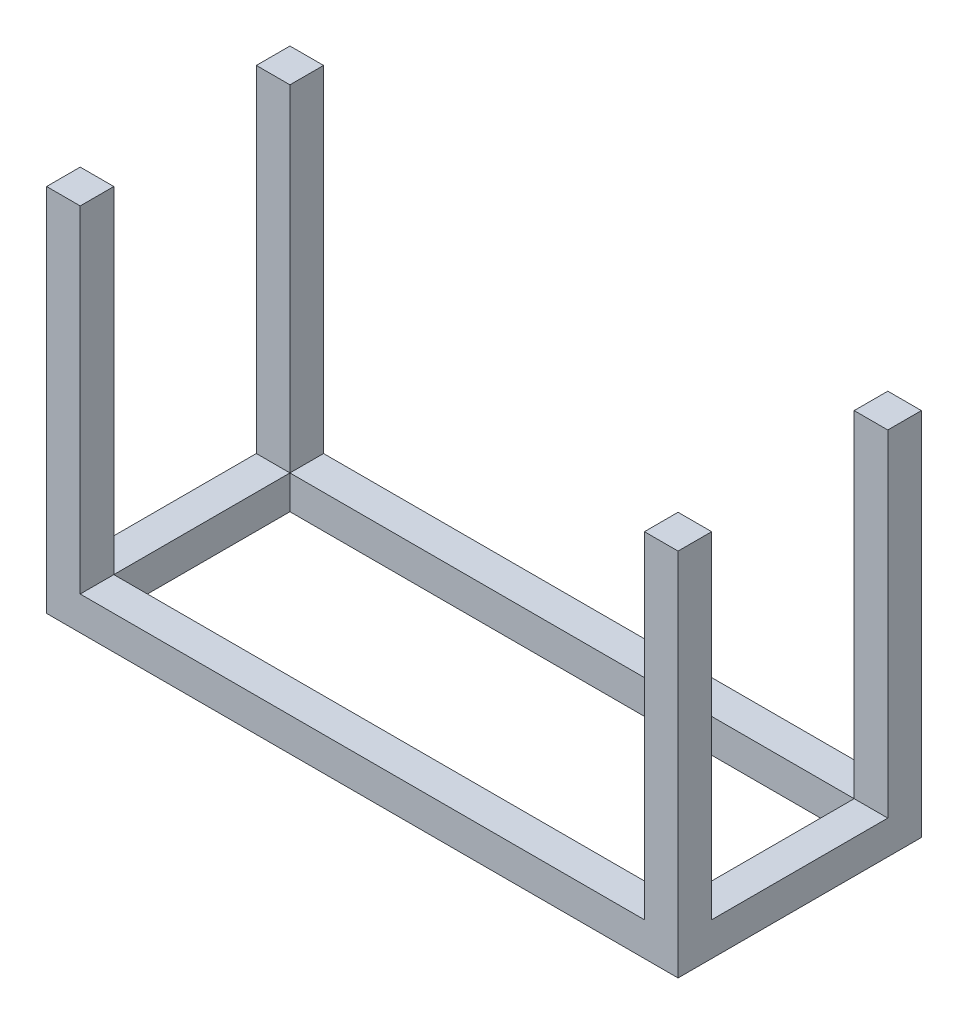
ISO-10303-21;
HEADER;
FILE_DESCRIPTION(('STEP AP214'),'2;1');
FILE_NAME('part.step','',(''),(''),'','','');
FILE_SCHEMA(('AUTOMOTIVE_DESIGN { 1 0 10303 214 1 1 1 1 }'));
ENDSEC;
DATA;
#1=APPLICATION_CONTEXT('core data for automotive mechanical design processes');
#2=APPLICATION_PROTOCOL_DEFINITION('international standard','automotive_design',2000,#1);
#3=PRODUCT_CONTEXT('',#1,'mechanical');
#4=PRODUCT('Part','Part','',(#3));
#5=PRODUCT_RELATED_PRODUCT_CATEGORY('part','',(#4));
#6=PRODUCT_DEFINITION_FORMATION('','',#4);
#7=PRODUCT_DEFINITION_CONTEXT('part definition',#1,'design');
#8=PRODUCT_DEFINITION('design','',#6,#7);
#9=PRODUCT_DEFINITION_SHAPE('','',#8);
#10=(LENGTH_UNIT() NAMED_UNIT(*) SI_UNIT(.MILLI.,.METRE.));
#11=(NAMED_UNIT(*) PLANE_ANGLE_UNIT() SI_UNIT($,.RADIAN.));
#12=(NAMED_UNIT(*) SI_UNIT($,.STERADIAN.) SOLID_ANGLE_UNIT());
#13=UNCERTAINTY_MEASURE_WITH_UNIT(LENGTH_MEASURE(1.E-05),#10,'distance_accuracy_value','');
#14=(GEOMETRIC_REPRESENTATION_CONTEXT(3) GLOBAL_UNCERTAINTY_ASSIGNED_CONTEXT((#13)) GLOBAL_UNIT_ASSIGNED_CONTEXT((#10,
#11,#12)) REPRESENTATION_CONTEXT('',''));
#15=CARTESIAN_POINT('',(0.,0.,0.));
#16=DIRECTION('',(0.,0.,1.));
#17=DIRECTION('',(1.,0.,0.));
#18=AXIS2_PLACEMENT_3D('',#15,#16,#17);
#19=CARTESIAN_POINT('',(0.,7.5,0.));
#20=DIRECTION('',(0.,-1.,0.));
#21=DIRECTION('',(0.,0.,-1.));
#22=AXIS2_PLACEMENT_3D('',#19,#20,#21);
#23=PLANE('',#22);
#24=DIRECTION('',(0.,0.,-1.));
#25=VECTOR('',#24,1.);
#26=CARTESIAN_POINT('',(-62.95,7.5,19.65));
#27=LINE('',#26,#25);
#28=CARTESIAN_POINT('',(-62.95,7.5,27.15));
#29=VERTEX_POINT('',#28);
#30=CARTESIAN_POINT('',(-62.95,7.5,19.65));
#31=VERTEX_POINT('',#30);
#32=EDGE_CURVE('E177',#29,#31,#27,.T.);
#33=ORIENTED_EDGE('',*,*,#32,.F.);
#34=DIRECTION('',(1.,0.,0.));
#35=VECTOR('',#34,1.);
#36=CARTESIAN_POINT('',(-70.45,7.5,27.15));
#37=LINE('',#36,#35);
#38=CARTESIAN_POINT('',(62.95,7.5,27.15));
#39=VERTEX_POINT('',#38);
#40=EDGE_CURVE('E162',#29,#39,#37,.T.);
#41=ORIENTED_EDGE('',*,*,#40,.T.);
#42=DIRECTION('',(0.,0.,1.));
#43=VECTOR('',#42,1.);
#44=CARTESIAN_POINT('',(62.95,7.5,19.65));
#45=LINE('',#44,#43);
#46=CARTESIAN_POINT('',(62.95,7.5,19.65));
#47=VERTEX_POINT('',#46);
#48=EDGE_CURVE('E213',#47,#39,#45,.T.);
#49=ORIENTED_EDGE('',*,*,#48,.F.);
#50=DIRECTION('',(1.,0.,0.));
#51=VECTOR('',#50,1.);
#52=CARTESIAN_POINT('',(-62.95,7.5,19.65));
#53=LINE('',#52,#51);
#54=EDGE_CURVE('E179',#31,#47,#53,.T.);
#55=ORIENTED_EDGE('',*,*,#54,.F.);
#56=EDGE_LOOP('',(#33,#41,#49,#55));
#57=FACE_BOUND('',#56,.T.);
#58=ADVANCED_FACE('F36',(#57),#23,.F.);
#59=DIRECTION('',(-1.,0.,0.));
#60=VECTOR('',#59,1.);
#61=CARTESIAN_POINT('',(-62.95,7.5,19.65));
#62=LINE('',#61,#60);
#63=CARTESIAN_POINT('',(-70.45,7.5,19.65));
#64=VERTEX_POINT('',#63);
#65=EDGE_CURVE('E183',#31,#64,#62,.T.);
#66=ORIENTED_EDGE('',*,*,#65,.F.);
#67=DIRECTION('',(0.,0.,1.));
#68=VECTOR('',#67,1.);
#69=CARTESIAN_POINT('',(-62.95,7.5,19.65));
#70=LINE('',#69,#68);
#71=CARTESIAN_POINT('',(-62.95,7.5,-19.65));
#72=VERTEX_POINT('',#71);
#73=EDGE_CURVE('E282',#72,#31,#70,.T.);
#74=ORIENTED_EDGE('',*,*,#73,.F.);
#75=DIRECTION('',(1.,0.,0.));
#76=VECTOR('',#75,1.);
#77=CARTESIAN_POINT('',(-70.45,7.5,-19.65));
#78=LINE('',#77,#76);
#79=CARTESIAN_POINT('',(-70.45,7.5,-19.65));
#80=VERTEX_POINT('',#79);
#81=EDGE_CURVE('E241',#80,#72,#78,.T.);
#82=ORIENTED_EDGE('',*,*,#81,.F.);
#83=DIRECTION('',(0.,0.,1.));
#84=VECTOR('',#83,1.);
#85=CARTESIAN_POINT('',(-70.45,7.5,27.15));
#86=LINE('',#85,#84);
#87=EDGE_CURVE('E51',#80,#64,#86,.T.);
#88=ORIENTED_EDGE('',*,*,#87,.T.);
#89=EDGE_LOOP('',(#66,#74,#82,#88));
#90=FACE_BOUND('',#89,.T.);
#91=ADVANCED_FACE('F368',(#90),#23,.F.);
#92=DIRECTION('',(-1.,0.,0.));
#93=VECTOR('',#92,1.);
#94=CARTESIAN_POINT('',(62.95,7.5,19.65));
#95=LINE('',#94,#93);
#96=CARTESIAN_POINT('',(70.45,7.5,19.65));
#97=VERTEX_POINT('',#96);
#98=EDGE_CURVE('E59',#97,#47,#95,.T.);
#99=ORIENTED_EDGE('',*,*,#98,.F.);
#100=DIRECTION('',(0.,0.,-1.));
#101=VECTOR('',#100,1.);
#102=CARTESIAN_POINT('',(70.45,7.5,27.15));
#103=LINE('',#102,#101);
#104=CARTESIAN_POINT('',(70.45,7.5,-19.65));
#105=VERTEX_POINT('',#104);
#106=EDGE_CURVE('E307',#97,#105,#103,.T.);
#107=ORIENTED_EDGE('',*,*,#106,.T.);
#108=DIRECTION('',(1.,0.,0.));
#109=VECTOR('',#108,1.);
#110=CARTESIAN_POINT('',(62.95,7.5,-19.65));
#111=LINE('',#110,#109);
#112=CARTESIAN_POINT('',(62.95,7.5,-19.65));
#113=VERTEX_POINT('',#112);
#114=EDGE_CURVE('E234',#113,#105,#111,.T.);
#115=ORIENTED_EDGE('',*,*,#114,.F.);
#116=DIRECTION('',(0.,0.,-1.));
#117=VECTOR('',#116,1.);
#118=CARTESIAN_POINT('',(62.95,7.5,19.65));
#119=LINE('',#118,#117);
#120=EDGE_CURVE('E275',#47,#113,#119,.T.);
#121=ORIENTED_EDGE('',*,*,#120,.F.);
#122=EDGE_LOOP('',(#99,#107,#115,#121));
#123=FACE_BOUND('',#122,.T.);
#124=ADVANCED_FACE('F355',(#123),#23,.F.);
#125=DIRECTION('',(0.,0.,1.));
#126=VECTOR('',#125,1.);
#127=CARTESIAN_POINT('',(62.95,7.5,-19.65));
#128=LINE('',#127,#126);
#129=CARTESIAN_POINT('',(62.95,7.5,-27.15));
#130=VERTEX_POINT('',#129);
#131=EDGE_CURVE('E237',#130,#113,#128,.T.);
#132=ORIENTED_EDGE('',*,*,#131,.F.);
#133=DIRECTION('',(-1.,0.,0.));
#134=VECTOR('',#133,1.);
#135=CARTESIAN_POINT('',(-70.45,7.5,-27.15));
#136=LINE('',#135,#134);
#137=CARTESIAN_POINT('',(-62.95,7.5,-27.15));
#138=VERTEX_POINT('',#137);
#139=EDGE_CURVE('E309',#130,#138,#136,.T.);
#140=ORIENTED_EDGE('',*,*,#139,.T.);
#141=DIRECTION('',(0.,0.,-1.));
#142=VECTOR('',#141,1.);
#143=CARTESIAN_POINT('',(-62.95,7.5,-27.15));
#144=LINE('',#143,#142);
#145=EDGE_CURVE('E254',#72,#138,#144,.T.);
#146=ORIENTED_EDGE('',*,*,#145,.F.);
#147=DIRECTION('',(-1.,0.,0.));
#148=VECTOR('',#147,1.);
#149=CARTESIAN_POINT('',(-62.95,7.5,-19.65));
#150=LINE('',#149,#148);
#151=EDGE_CURVE('E278',#113,#72,#150,.T.);
#152=ORIENTED_EDGE('',*,*,#151,.F.);
#153=EDGE_LOOP('',(#132,#140,#146,#152));
#154=FACE_BOUND('',#153,.T.);
#155=ADVANCED_FACE('F370',(#154),#23,.F.);
#156=CARTESIAN_POINT('',(0.,0.,0.));
#157=DIRECTION('',(0.,-1.,0.));
#158=DIRECTION('',(0.,0.,-1.));
#159=AXIS2_PLACEMENT_3D('',#156,#157,#158);
#160=PLANE('',#159);
#161=DIRECTION('',(0.,0.,-1.));
#162=VECTOR('',#161,1.);
#163=CARTESIAN_POINT('',(70.45,0.,27.15));
#164=LINE('',#163,#162);
#165=CARTESIAN_POINT('',(70.45,0.,27.15));
#166=VERTEX_POINT('',#165);
#167=CARTESIAN_POINT('',(70.45,0.,-27.15));
#168=VERTEX_POINT('',#167);
#169=EDGE_CURVE('E306',#166,#168,#164,.T.);
#170=ORIENTED_EDGE('',*,*,#169,.F.);
#171=DIRECTION('',(1.,0.,0.));
#172=VECTOR('',#171,1.);
#173=CARTESIAN_POINT('',(-70.45,0.,27.15));
#174=LINE('',#173,#172);
#175=CARTESIAN_POINT('',(-70.45,0.,27.15));
#176=VERTEX_POINT('',#175);
#177=EDGE_CURVE('E310',#176,#166,#174,.T.);
#178=ORIENTED_EDGE('',*,*,#177,.F.);
#179=DIRECTION('',(0.,0.,1.));
#180=VECTOR('',#179,1.);
#181=CARTESIAN_POINT('',(-70.45,0.,27.15));
#182=LINE('',#181,#180);
#183=CARTESIAN_POINT('',(-70.45,0.,-27.15));
#184=VERTEX_POINT('',#183);
#185=EDGE_CURVE('E317',#184,#176,#182,.T.);
#186=ORIENTED_EDGE('',*,*,#185,.F.);
#187=DIRECTION('',(-1.,0.,0.));
#188=VECTOR('',#187,1.);
#189=CARTESIAN_POINT('',(-70.45,0.,-27.15));
#190=LINE('',#189,#188);
#191=EDGE_CURVE('E315',#168,#184,#190,.T.);
#192=ORIENTED_EDGE('',*,*,#191,.F.);
#193=EDGE_LOOP('',(#170,#178,#186,#192));
#194=FACE_BOUND('',#193,.T.);
#195=DIRECTION('',(1.,0.,0.));
#196=VECTOR('',#195,1.);
#197=CARTESIAN_POINT('',(-62.95,0.,19.65));
#198=LINE('',#197,#196);
#199=CARTESIAN_POINT('',(-62.95,0.,19.65));
#200=VERTEX_POINT('',#199);
#201=CARTESIAN_POINT('',(62.95,0.,19.65));
#202=VERTEX_POINT('',#201);
#203=EDGE_CURVE('E279',#200,#202,#198,.T.);
#204=ORIENTED_EDGE('',*,*,#203,.T.);
#205=DIRECTION('',(0.,0.,-1.));
#206=VECTOR('',#205,1.);
#207=CARTESIAN_POINT('',(62.95,0.,19.65));
#208=LINE('',#207,#206);
#209=CARTESIAN_POINT('',(62.95,0.,-19.65));
#210=VERTEX_POINT('',#209);
#211=EDGE_CURVE('E274',#202,#210,#208,.T.);
#212=ORIENTED_EDGE('',*,*,#211,.T.);
#213=DIRECTION('',(-1.,0.,0.));
#214=VECTOR('',#213,1.);
#215=CARTESIAN_POINT('',(-62.95,0.,-19.65));
#216=LINE('',#215,#214);
#217=CARTESIAN_POINT('',(-62.95,0.,-19.65));
#218=VERTEX_POINT('',#217);
#219=EDGE_CURVE('E289',#210,#218,#216,.T.);
#220=ORIENTED_EDGE('',*,*,#219,.T.);
#221=DIRECTION('',(0.,0.,1.));
#222=VECTOR('',#221,1.);
#223=CARTESIAN_POINT('',(-62.95,0.,19.65));
#224=LINE('',#223,#222);
#225=EDGE_CURVE('E292',#218,#200,#224,.T.);
#226=ORIENTED_EDGE('',*,*,#225,.T.);
#227=EDGE_LOOP('',(#204,#212,#220,#226));
#228=FACE_BOUND('',#227,.T.);
#229=ADVANCED_FACE('F335',(#194,#228),#160,.T.);
#230=CARTESIAN_POINT('',(70.45,7.5,27.15));
#231=DIRECTION('',(-1.,0.,0.));
#232=DIRECTION('',(0.,0.,1.));
#233=AXIS2_PLACEMENT_3D('',#230,#231,#232);
#234=PLANE('',#233);
#235=ORIENTED_EDGE('',*,*,#169,.T.);
#236=DIRECTION('',(0.,-1.,0.));
#237=VECTOR('',#236,1.);
#238=CARTESIAN_POINT('',(70.45,7.5,-27.15));
#239=LINE('',#238,#237);
#240=CARTESIAN_POINT('',(70.45,82.5,-27.15));
#241=VERTEX_POINT('',#240);
#242=EDGE_CURVE('E11',#241,#168,#239,.T.);
#243=ORIENTED_EDGE('',*,*,#242,.F.);
#244=DIRECTION('',(0.,0.,-1.));
#245=VECTOR('',#244,1.);
#246=CARTESIAN_POINT('',(70.45,82.5,-19.65));
#247=LINE('',#246,#245);
#248=CARTESIAN_POINT('',(70.45,82.5,-19.65));
#249=VERTEX_POINT('',#248);
#250=EDGE_CURVE('E243',#249,#241,#247,.T.);
#251=ORIENTED_EDGE('',*,*,#250,.F.);
#252=DIRECTION('',(0.,-1.,0.));
#253=VECTOR('',#252,1.);
#254=CARTESIAN_POINT('',(70.45,82.5,-19.65));
#255=LINE('',#254,#253);
#256=EDGE_CURVE('E227',#249,#105,#255,.T.);
#257=ORIENTED_EDGE('',*,*,#256,.T.);
#258=ORIENTED_EDGE('',*,*,#106,.F.);
#259=DIRECTION('',(0.,-1.,0.));
#260=VECTOR('',#259,1.);
#261=CARTESIAN_POINT('',(70.45,82.5,19.65));
#262=LINE('',#261,#260);
#263=CARTESIAN_POINT('',(70.45,82.5,19.65));
#264=VERTEX_POINT('',#263);
#265=EDGE_CURVE('E205',#264,#97,#262,.T.);
#266=ORIENTED_EDGE('',*,*,#265,.F.);
#267=DIRECTION('',(0.,0.,-1.));
#268=VECTOR('',#267,1.);
#269=CARTESIAN_POINT('',(70.45,82.5,19.65));
#270=LINE('',#269,#268);
#271=CARTESIAN_POINT('',(70.45,82.5,27.15));
#272=VERTEX_POINT('',#271);
#273=EDGE_CURVE('E218',#272,#264,#270,.T.);
#274=ORIENTED_EDGE('',*,*,#273,.F.);
#275=DIRECTION('',(0.,-1.,0.));
#276=VECTOR('',#275,1.);
#277=CARTESIAN_POINT('',(70.45,7.5,27.15));
#278=LINE('',#277,#276);
#279=EDGE_CURVE('E173',#272,#166,#278,.T.);
#280=ORIENTED_EDGE('',*,*,#279,.T.);
#281=EDGE_LOOP('',(#235,#243,#251,#257,#258,#266,#274,#280));
#282=FACE_BOUND('',#281,.T.);
#283=ADVANCED_FACE('F38',(#282),#234,.F.);
#284=CARTESIAN_POINT('',(-70.45,7.5,-27.15));
#285=DIRECTION('',(0.,0.,1.));
#286=DIRECTION('',(1.,0.,0.));
#287=AXIS2_PLACEMENT_3D('',#284,#285,#286);
#288=PLANE('',#287);
#289=ORIENTED_EDGE('',*,*,#191,.T.);
#290=DIRECTION('',(0.,-1.,0.));
#291=VECTOR('',#290,1.);
#292=CARTESIAN_POINT('',(-70.45,7.5,-27.15));
#293=LINE('',#292,#291);
#294=CARTESIAN_POINT('',(-70.45,82.5,-27.15));
#295=VERTEX_POINT('',#294);
#296=EDGE_CURVE('E44',#295,#184,#293,.T.);
#297=ORIENTED_EDGE('',*,*,#296,.F.);
#298=DIRECTION('',(-1.,0.,0.));
#299=VECTOR('',#298,1.);
#300=CARTESIAN_POINT('',(-70.45,82.5,-27.15));
#301=LINE('',#300,#299);
#302=CARTESIAN_POINT('',(-62.95,82.5,-27.15));
#303=VERTEX_POINT('',#302);
#304=EDGE_CURVE('E258',#303,#295,#301,.T.);
#305=ORIENTED_EDGE('',*,*,#304,.F.);
#306=DIRECTION('',(0.,-1.,0.));
#307=VECTOR('',#306,1.);
#308=CARTESIAN_POINT('',(-62.95,82.5,-27.15));
#309=LINE('',#308,#307);
#310=EDGE_CURVE('E261',#303,#138,#309,.T.);
#311=ORIENTED_EDGE('',*,*,#310,.T.);
#312=ORIENTED_EDGE('',*,*,#139,.F.);
#313=DIRECTION('',(0.,-1.,0.));
#314=VECTOR('',#313,1.);
#315=CARTESIAN_POINT('',(62.95,82.5,-27.15));
#316=LINE('',#315,#314);
#317=CARTESIAN_POINT('',(62.95,82.5,-27.15));
#318=VERTEX_POINT('',#317);
#319=EDGE_CURVE('E230',#318,#130,#316,.T.);
#320=ORIENTED_EDGE('',*,*,#319,.F.);
#321=DIRECTION('',(-1.,0.,0.));
#322=VECTOR('',#321,1.);
#323=CARTESIAN_POINT('',(62.95,82.5,-27.15));
#324=LINE('',#323,#322);
#325=EDGE_CURVE('E233',#241,#318,#324,.T.);
#326=ORIENTED_EDGE('',*,*,#325,.F.);
#327=ORIENTED_EDGE('',*,*,#242,.T.);
#328=EDGE_LOOP('',(#289,#297,#305,#311,#312,#320,#326,#327));
#329=FACE_BOUND('',#328,.T.);
#330=ADVANCED_FACE('F391',(#329),#288,.F.);
#331=CARTESIAN_POINT('',(-70.45,7.5,27.15));
#332=DIRECTION('',(1.,0.,0.));
#333=DIRECTION('',(0.,0.,-1.));
#334=AXIS2_PLACEMENT_3D('',#331,#332,#333);
#335=PLANE('',#334);
#336=ORIENTED_EDGE('',*,*,#185,.T.);
#337=DIRECTION('',(0.,-1.,0.));
#338=VECTOR('',#337,1.);
#339=CARTESIAN_POINT('',(-70.45,7.5,27.15));
#340=LINE('',#339,#338);
#341=CARTESIAN_POINT('',(-70.45,82.5,27.15));
#342=VERTEX_POINT('',#341);
#343=EDGE_CURVE('E322',#342,#176,#340,.T.);
#344=ORIENTED_EDGE('',*,*,#343,.F.);
#345=DIRECTION('',(0.,0.,1.));
#346=VECTOR('',#345,1.);
#347=CARTESIAN_POINT('',(-70.45,82.5,19.65));
#348=LINE('',#347,#346);
#349=CARTESIAN_POINT('',(-70.45,82.5,19.65));
#350=VERTEX_POINT('',#349);
#351=EDGE_CURVE('E191',#350,#342,#348,.T.);
#352=ORIENTED_EDGE('',*,*,#351,.F.);
#353=DIRECTION('',(0.,-1.,0.));
#354=VECTOR('',#353,1.);
#355=CARTESIAN_POINT('',(-70.45,82.5,19.65));
#356=LINE('',#355,#354);
#357=EDGE_CURVE('E189',#350,#64,#356,.T.);
#358=ORIENTED_EDGE('',*,*,#357,.T.);
#359=ORIENTED_EDGE('',*,*,#87,.F.);
#360=DIRECTION('',(0.,-1.,0.));
#361=VECTOR('',#360,1.);
#362=CARTESIAN_POINT('',(-70.45,82.5,-19.65));
#363=LINE('',#362,#361);
#364=CARTESIAN_POINT('',(-70.45,82.5,-19.65));
#365=VERTEX_POINT('',#364);
#366=EDGE_CURVE('E271',#365,#80,#363,.T.);
#367=ORIENTED_EDGE('',*,*,#366,.F.);
#368=DIRECTION('',(0.,0.,1.));
#369=VECTOR('',#368,1.);
#370=CARTESIAN_POINT('',(-70.45,82.5,-27.15));
#371=LINE('',#370,#369);
#372=EDGE_CURVE('E250',#295,#365,#371,.T.);
#373=ORIENTED_EDGE('',*,*,#372,.F.);
#374=ORIENTED_EDGE('',*,*,#296,.T.);
#375=EDGE_LOOP('',(#336,#344,#352,#358,#359,#367,#373,#374));
#376=FACE_BOUND('',#375,.T.);
#377=ADVANCED_FACE('F328',(#376),#335,.F.);
#378=CARTESIAN_POINT('',(-70.45,7.5,27.15));
#379=DIRECTION('',(0.,0.,-1.));
#380=DIRECTION('',(-1.,0.,0.));
#381=AXIS2_PLACEMENT_3D('',#378,#379,#380);
#382=PLANE('',#381);
#383=ORIENTED_EDGE('',*,*,#177,.T.);
#384=ORIENTED_EDGE('',*,*,#279,.F.);
#385=DIRECTION('',(1.,0.,0.));
#386=VECTOR('',#385,1.);
#387=CARTESIAN_POINT('',(62.95,82.5,27.15));
#388=LINE('',#387,#386);
#389=CARTESIAN_POINT('',(62.95,82.5,27.15));
#390=VERTEX_POINT('',#389);
#391=EDGE_CURVE('E220',#390,#272,#388,.T.);
#392=ORIENTED_EDGE('',*,*,#391,.F.);
#393=DIRECTION('',(0.,-1.,0.));
#394=VECTOR('',#393,1.);
#395=CARTESIAN_POINT('',(62.95,82.5,27.15));
#396=LINE('',#395,#394);
#397=EDGE_CURVE('E170',#390,#39,#396,.T.);
#398=ORIENTED_EDGE('',*,*,#397,.T.);
#399=ORIENTED_EDGE('',*,*,#40,.F.);
#400=DIRECTION('',(0.,-1.,0.));
#401=VECTOR('',#400,1.);
#402=CARTESIAN_POINT('',(-62.95,82.5,27.15));
#403=LINE('',#402,#401);
#404=CARTESIAN_POINT('',(-62.95,82.5,27.15));
#405=VERTEX_POINT('',#404);
#406=EDGE_CURVE('E167',#405,#29,#403,.T.);
#407=ORIENTED_EDGE('',*,*,#406,.F.);
#408=DIRECTION('',(1.,0.,0.));
#409=VECTOR('',#408,1.);
#410=CARTESIAN_POINT('',(-62.95,82.5,27.15));
#411=LINE('',#410,#409);
#412=EDGE_CURVE('E188',#342,#405,#411,.T.);
#413=ORIENTED_EDGE('',*,*,#412,.F.);
#414=ORIENTED_EDGE('',*,*,#343,.T.);
#415=EDGE_LOOP('',(#383,#384,#392,#398,#399,#407,#413,#414));
#416=FACE_BOUND('',#415,.T.);
#417=ADVANCED_FACE('F164',(#416),#382,.F.);
#418=CARTESIAN_POINT('',(62.95,7.5,19.65));
#419=DIRECTION('',(-1.,0.,0.));
#420=DIRECTION('',(0.,0.,1.));
#421=AXIS2_PLACEMENT_3D('',#418,#419,#420);
#422=PLANE('',#421);
#423=ORIENTED_EDGE('',*,*,#211,.F.);
#424=DIRECTION('',(0.,-1.,0.));
#425=VECTOR('',#424,1.);
#426=CARTESIAN_POINT('',(62.95,7.5,19.65));
#427=LINE('',#426,#425);
#428=EDGE_CURVE('E286',#47,#202,#427,.T.);
#429=ORIENTED_EDGE('',*,*,#428,.F.);
#430=ORIENTED_EDGE('',*,*,#120,.T.);
#431=DIRECTION('',(0.,-1.,0.));
#432=VECTOR('',#431,1.);
#433=CARTESIAN_POINT('',(62.95,7.5,-19.65));
#434=LINE('',#433,#432);
#435=EDGE_CURVE('E303',#113,#210,#434,.T.);
#436=ORIENTED_EDGE('',*,*,#435,.T.);
#437=EDGE_LOOP('',(#423,#429,#430,#436));
#438=FACE_BOUND('',#437,.T.);
#439=ADVANCED_FACE('F353',(#438),#422,.T.);
#440=CARTESIAN_POINT('',(-62.95,7.5,-19.65));
#441=DIRECTION('',(0.,0.,1.));
#442=DIRECTION('',(1.,0.,0.));
#443=AXIS2_PLACEMENT_3D('',#440,#441,#442);
#444=PLANE('',#443);
#445=ORIENTED_EDGE('',*,*,#219,.F.);
#446=ORIENTED_EDGE('',*,*,#435,.F.);
#447=ORIENTED_EDGE('',*,*,#151,.T.);
#448=DIRECTION('',(0.,-1.,0.));
#449=VECTOR('',#448,1.);
#450=CARTESIAN_POINT('',(-62.95,7.5,-19.65));
#451=LINE('',#450,#449);
#452=EDGE_CURVE('E301',#72,#218,#451,.T.);
#453=ORIENTED_EDGE('',*,*,#452,.T.);
#454=EDGE_LOOP('',(#445,#446,#447,#453));
#455=FACE_BOUND('',#454,.T.);
#456=ADVANCED_FACE('F546',(#455),#444,.T.);
#457=CARTESIAN_POINT('',(-62.95,7.5,19.65));
#458=DIRECTION('',(1.,0.,0.));
#459=DIRECTION('',(0.,0.,-1.));
#460=AXIS2_PLACEMENT_3D('',#457,#458,#459);
#461=PLANE('',#460);
#462=ORIENTED_EDGE('',*,*,#225,.F.);
#463=ORIENTED_EDGE('',*,*,#452,.F.);
#464=ORIENTED_EDGE('',*,*,#73,.T.);
#465=DIRECTION('',(0.,-1.,0.));
#466=VECTOR('',#465,1.);
#467=CARTESIAN_POINT('',(-62.95,7.5,19.65));
#468=LINE('',#467,#466);
#469=EDGE_CURVE('E299',#31,#200,#468,.T.);
#470=ORIENTED_EDGE('',*,*,#469,.T.);
#471=EDGE_LOOP('',(#462,#463,#464,#470));
#472=FACE_BOUND('',#471,.T.);
#473=ADVANCED_FACE('F537',(#472),#461,.T.);
#474=CARTESIAN_POINT('',(-62.95,7.5,19.65));
#475=DIRECTION('',(0.,0.,-1.));
#476=DIRECTION('',(-1.,0.,0.));
#477=AXIS2_PLACEMENT_3D('',#474,#475,#476);
#478=PLANE('',#477);
#479=ORIENTED_EDGE('',*,*,#203,.F.);
#480=ORIENTED_EDGE('',*,*,#469,.F.);
#481=ORIENTED_EDGE('',*,*,#54,.T.);
#482=ORIENTED_EDGE('',*,*,#428,.T.);
#483=EDGE_LOOP('',(#479,#480,#481,#482));
#484=FACE_BOUND('',#483,.T.);
#485=ADVANCED_FACE('F351',(#484),#478,.T.);
#486=CARTESIAN_POINT('',(-70.45,82.5,-19.65));
#487=DIRECTION('',(0.,0.,-1.));
#488=DIRECTION('',(-1.,0.,0.));
#489=AXIS2_PLACEMENT_3D('',#486,#487,#488);
#490=PLANE('',#489);
#491=ORIENTED_EDGE('',*,*,#81,.T.);
#492=DIRECTION('',(0.,-1.,0.));
#493=VECTOR('',#492,1.);
#494=CARTESIAN_POINT('',(-62.95,82.5,-19.65));
#495=LINE('',#494,#493);
#496=CARTESIAN_POINT('',(-62.95,82.5,-19.65));
#497=VERTEX_POINT('',#496);
#498=EDGE_CURVE('E268',#497,#72,#495,.T.);
#499=ORIENTED_EDGE('',*,*,#498,.F.);
#500=DIRECTION('',(1.,0.,0.));
#501=VECTOR('',#500,1.);
#502=CARTESIAN_POINT('',(-70.45,82.5,-19.65));
#503=LINE('',#502,#501);
#504=EDGE_CURVE('E253',#365,#497,#503,.T.);
#505=ORIENTED_EDGE('',*,*,#504,.F.);
#506=ORIENTED_EDGE('',*,*,#366,.T.);
#507=EDGE_LOOP('',(#491,#499,#505,#506));
#508=FACE_BOUND('',#507,.T.);
#509=ADVANCED_FACE('F398',(#508),#490,.F.);
#510=CARTESIAN_POINT('',(-62.95,82.5,-27.15));
#511=DIRECTION('',(-1.,0.,0.));
#512=DIRECTION('',(0.,0.,1.));
#513=AXIS2_PLACEMENT_3D('',#510,#511,#512);
#514=PLANE('',#513);
#515=ORIENTED_EDGE('',*,*,#145,.T.);
#516=ORIENTED_EDGE('',*,*,#310,.F.);
#517=DIRECTION('',(0.,0.,-1.));
#518=VECTOR('',#517,1.);
#519=CARTESIAN_POINT('',(-62.95,82.5,-27.15));
#520=LINE('',#519,#518);
#521=EDGE_CURVE('E256',#497,#303,#520,.T.);
#522=ORIENTED_EDGE('',*,*,#521,.F.);
#523=ORIENTED_EDGE('',*,*,#498,.T.);
#524=EDGE_LOOP('',(#515,#516,#522,#523));
#525=FACE_BOUND('',#524,.T.);
#526=ADVANCED_FACE('F395',(#525),#514,.F.);
#527=CARTESIAN_POINT('',(0.,82.5,0.));
#528=DIRECTION('',(0.,1.,0.));
#529=DIRECTION('',(0.,0.,1.));
#530=AXIS2_PLACEMENT_3D('',#527,#528,#529);
#531=PLANE('',#530);
#532=ORIENTED_EDGE('',*,*,#372,.T.);
#533=ORIENTED_EDGE('',*,*,#504,.T.);
#534=ORIENTED_EDGE('',*,*,#521,.T.);
#535=ORIENTED_EDGE('',*,*,#304,.T.);
#536=EDGE_LOOP('',(#532,#533,#534,#535));
#537=FACE_BOUND('',#536,.T.);
#538=ADVANCED_FACE('F478',(#537),#531,.T.);
#539=CARTESIAN_POINT('',(62.95,82.5,-19.65));
#540=DIRECTION('',(1.,0.,0.));
#541=DIRECTION('',(0.,0.,-1.));
#542=AXIS2_PLACEMENT_3D('',#539,#540,#541);
#543=PLANE('',#542);
#544=ORIENTED_EDGE('',*,*,#131,.T.);
#545=DIRECTION('',(0.,-1.,0.));
#546=VECTOR('',#545,1.);
#547=CARTESIAN_POINT('',(62.95,82.5,-19.65));
#548=LINE('',#547,#546);
#549=CARTESIAN_POINT('',(62.95,82.5,-19.65));
#550=VERTEX_POINT('',#549);
#551=EDGE_CURVE('E216',#550,#113,#548,.T.);
#552=ORIENTED_EDGE('',*,*,#551,.F.);
#553=DIRECTION('',(0.,0.,1.));
#554=VECTOR('',#553,1.);
#555=CARTESIAN_POINT('',(62.95,82.5,-19.65));
#556=LINE('',#555,#554);
#557=EDGE_CURVE('E238',#318,#550,#556,.T.);
#558=ORIENTED_EDGE('',*,*,#557,.F.);
#559=ORIENTED_EDGE('',*,*,#319,.T.);
#560=EDGE_LOOP('',(#544,#552,#558,#559));
#561=FACE_BOUND('',#560,.T.);
#562=ADVANCED_FACE('F389',(#561),#543,.F.);
#563=CARTESIAN_POINT('',(62.95,82.5,-19.65));
#564=DIRECTION('',(0.,0.,-1.));
#565=DIRECTION('',(-1.,0.,0.));
#566=AXIS2_PLACEMENT_3D('',#563,#564,#565);
#567=PLANE('',#566);
#568=ORIENTED_EDGE('',*,*,#114,.T.);
#569=ORIENTED_EDGE('',*,*,#256,.F.);
#570=DIRECTION('',(1.,0.,0.));
#571=VECTOR('',#570,1.);
#572=CARTESIAN_POINT('',(62.95,82.5,-19.65));
#573=LINE('',#572,#571);
#574=EDGE_CURVE('E246',#550,#249,#573,.T.);
#575=ORIENTED_EDGE('',*,*,#574,.F.);
#576=ORIENTED_EDGE('',*,*,#551,.T.);
#577=EDGE_LOOP('',(#568,#569,#575,#576));
#578=FACE_BOUND('',#577,.T.);
#579=ADVANCED_FACE('F459',(#578),#567,.F.);
#580=CARTESIAN_POINT('',(0.,82.5,0.));
#581=DIRECTION('',(0.,-1.,0.));
#582=DIRECTION('',(0.,0.,-1.));
#583=AXIS2_PLACEMENT_3D('',#580,#581,#582);
#584=PLANE('',#583);
#585=ORIENTED_EDGE('',*,*,#557,.T.);
#586=ORIENTED_EDGE('',*,*,#574,.T.);
#587=ORIENTED_EDGE('',*,*,#250,.T.);
#588=ORIENTED_EDGE('',*,*,#325,.T.);
#589=EDGE_LOOP('',(#585,#586,#587,#588));
#590=FACE_BOUND('',#589,.T.);
#591=ADVANCED_FACE('F365',(#590),#584,.F.);
#592=CARTESIAN_POINT('',(62.95,82.5,19.65));
#593=DIRECTION('',(1.,0.,0.));
#594=DIRECTION('',(0.,0.,-1.));
#595=AXIS2_PLACEMENT_3D('',#592,#593,#594);
#596=PLANE('',#595);
#597=ORIENTED_EDGE('',*,*,#48,.T.);
#598=ORIENTED_EDGE('',*,*,#397,.F.);
#599=DIRECTION('',(0.,0.,1.));
#600=VECTOR('',#599,1.);
#601=CARTESIAN_POINT('',(62.95,82.5,19.65));
#602=LINE('',#601,#600);
#603=CARTESIAN_POINT('',(62.95,82.5,19.65));
#604=VERTEX_POINT('',#603);
#605=EDGE_CURVE('E214',#604,#390,#602,.T.);
#606=ORIENTED_EDGE('',*,*,#605,.F.);
#607=DIRECTION('',(0.,-1.,0.));
#608=VECTOR('',#607,1.);
#609=CARTESIAN_POINT('',(62.95,82.5,19.65));
#610=LINE('',#609,#608);
#611=EDGE_CURVE('E208',#604,#47,#610,.T.);
#612=ORIENTED_EDGE('',*,*,#611,.T.);
#613=EDGE_LOOP('',(#597,#598,#606,#612));
#614=FACE_BOUND('',#613,.T.);
#615=ADVANCED_FACE('F346',(#614),#596,.F.);
#616=CARTESIAN_POINT('',(62.95,82.5,19.65));
#617=DIRECTION('',(0.,0.,1.));
#618=DIRECTION('',(1.,0.,0.));
#619=AXIS2_PLACEMENT_3D('',#616,#617,#618);
#620=PLANE('',#619);
#621=ORIENTED_EDGE('',*,*,#98,.T.);
#622=ORIENTED_EDGE('',*,*,#611,.F.);
#623=DIRECTION('',(-1.,0.,0.));
#624=VECTOR('',#623,1.);
#625=CARTESIAN_POINT('',(62.95,82.5,19.65));
#626=LINE('',#625,#624);
#627=EDGE_CURVE('E211',#264,#604,#626,.T.);
#628=ORIENTED_EDGE('',*,*,#627,.F.);
#629=ORIENTED_EDGE('',*,*,#265,.T.);
#630=EDGE_LOOP('',(#621,#622,#628,#629));
#631=FACE_BOUND('',#630,.T.);
#632=ADVANCED_FACE('F357',(#631),#620,.F.);
#633=CARTESIAN_POINT('',(0.,82.5,0.));
#634=DIRECTION('',(0.,1.,0.));
#635=DIRECTION('',(0.,0.,1.));
#636=AXIS2_PLACEMENT_3D('',#633,#634,#635);
#637=PLANE('',#636);
#638=ORIENTED_EDGE('',*,*,#605,.T.);
#639=ORIENTED_EDGE('',*,*,#391,.T.);
#640=ORIENTED_EDGE('',*,*,#273,.T.);
#641=ORIENTED_EDGE('',*,*,#627,.T.);
#642=EDGE_LOOP('',(#638,#639,#640,#641));
#643=FACE_BOUND('',#642,.T.);
#644=ADVANCED_FACE('F342',(#643),#637,.T.);
#645=CARTESIAN_POINT('',(-62.95,82.5,19.65));
#646=DIRECTION('',(-1.,0.,0.));
#647=DIRECTION('',(0.,0.,1.));
#648=AXIS2_PLACEMENT_3D('',#645,#646,#647);
#649=PLANE('',#648);
#650=ORIENTED_EDGE('',*,*,#32,.T.);
#651=DIRECTION('',(0.,-1.,0.));
#652=VECTOR('',#651,1.);
#653=CARTESIAN_POINT('',(-62.95,82.5,19.65));
#654=LINE('',#653,#652);
#655=CARTESIAN_POINT('',(-62.95,82.5,19.65));
#656=VERTEX_POINT('',#655);
#657=EDGE_CURVE('E194',#656,#31,#654,.T.);
#658=ORIENTED_EDGE('',*,*,#657,.F.);
#659=DIRECTION('',(0.,0.,-1.));
#660=VECTOR('',#659,1.);
#661=CARTESIAN_POINT('',(-62.95,82.5,19.65));
#662=LINE('',#661,#660);
#663=EDGE_CURVE('E187',#405,#656,#662,.T.);
#664=ORIENTED_EDGE('',*,*,#663,.F.);
#665=ORIENTED_EDGE('',*,*,#406,.T.);
#666=EDGE_LOOP('',(#650,#658,#664,#665));
#667=FACE_BOUND('',#666,.T.);
#668=ADVANCED_FACE('F185',(#667),#649,.F.);
#669=CARTESIAN_POINT('',(-62.95,82.5,19.65));
#670=DIRECTION('',(0.,0.,1.));
#671=DIRECTION('',(1.,0.,0.));
#672=AXIS2_PLACEMENT_3D('',#669,#670,#671);
#673=PLANE('',#672);
#674=ORIENTED_EDGE('',*,*,#65,.T.);
#675=ORIENTED_EDGE('',*,*,#357,.F.);
#676=DIRECTION('',(-1.,0.,0.));
#677=VECTOR('',#676,1.);
#678=CARTESIAN_POINT('',(-62.95,82.5,19.65));
#679=LINE('',#678,#677);
#680=EDGE_CURVE('E201',#656,#350,#679,.T.);
#681=ORIENTED_EDGE('',*,*,#680,.F.);
#682=ORIENTED_EDGE('',*,*,#657,.T.);
#683=EDGE_LOOP('',(#674,#675,#681,#682));
#684=FACE_BOUND('',#683,.T.);
#685=ADVANCED_FACE('F403',(#684),#673,.F.);
#686=CARTESIAN_POINT('',(0.,82.5,0.));
#687=DIRECTION('',(0.,-1.,0.));
#688=DIRECTION('',(0.,0.,-1.));
#689=AXIS2_PLACEMENT_3D('',#686,#687,#688);
#690=PLANE('',#689);
#691=ORIENTED_EDGE('',*,*,#663,.T.);
#692=ORIENTED_EDGE('',*,*,#680,.T.);
#693=ORIENTED_EDGE('',*,*,#351,.T.);
#694=ORIENTED_EDGE('',*,*,#412,.T.);
#695=EDGE_LOOP('',(#691,#692,#693,#694));
#696=FACE_BOUND('',#695,.T.);
#697=ADVANCED_FACE('F405',(#696),#690,.F.);
#698=CLOSED_SHELL('',(#58,#91,#124,#155,#229,#283,#330,#377,#417,#439,#456,#473,#485,#509,#526,
#538,#562,#579,#591,#615,#632,#644,#668,#685,#697));
#699=MANIFOLD_SOLID_BREP('B2',#698);
#700=ADVANCED_BREP_SHAPE_REPRESENTATION('',(#18,#699),#14);
#701=SHAPE_DEFINITION_REPRESENTATION(#9,#700);
ENDSEC;
END-ISO-10303-21;
